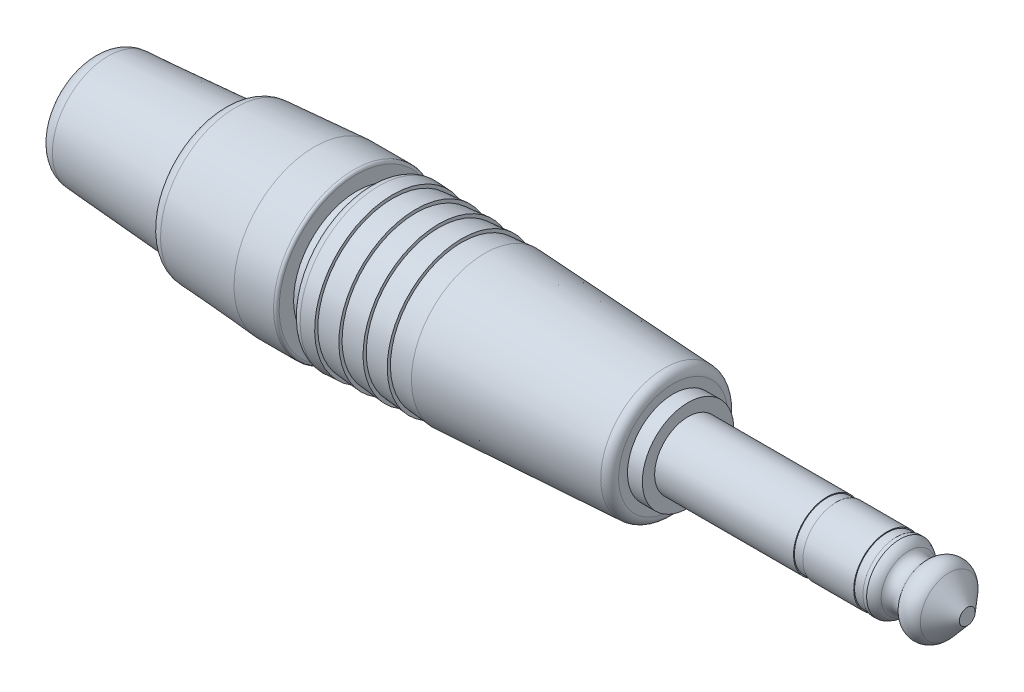
ISO-10303-21;
HEADER;
FILE_DESCRIPTION(('STEP AP214'),'2;1');
FILE_NAME('part.step','',(''),(''),'','','');
FILE_SCHEMA(('AUTOMOTIVE_DESIGN { 1 0 10303 214 1 1 1 1 }'));
ENDSEC;
DATA;
#1=APPLICATION_CONTEXT('core data for automotive mechanical design processes');
#2=APPLICATION_PROTOCOL_DEFINITION('international standard','automotive_design',2000,#1);
#3=PRODUCT_CONTEXT('',#1,'mechanical');
#4=PRODUCT('Part','Part','',(#3));
#5=PRODUCT_RELATED_PRODUCT_CATEGORY('part','',(#4));
#6=PRODUCT_DEFINITION_FORMATION('','',#4);
#7=PRODUCT_DEFINITION_CONTEXT('part definition',#1,'design');
#8=PRODUCT_DEFINITION('design','',#6,#7);
#9=PRODUCT_DEFINITION_SHAPE('','',#8);
#10=(LENGTH_UNIT() NAMED_UNIT(*) SI_UNIT(.MILLI.,.METRE.));
#11=(NAMED_UNIT(*) PLANE_ANGLE_UNIT() SI_UNIT($,.RADIAN.));
#12=(NAMED_UNIT(*) SI_UNIT($,.STERADIAN.) SOLID_ANGLE_UNIT());
#13=UNCERTAINTY_MEASURE_WITH_UNIT(LENGTH_MEASURE(1.E-05),#10,'distance_accuracy_value','');
#14=(GEOMETRIC_REPRESENTATION_CONTEXT(3) GLOBAL_UNCERTAINTY_ASSIGNED_CONTEXT((#13)) GLOBAL_UNIT_ASSIGNED_CONTEXT((#10,
#11,#12)) REPRESENTATION_CONTEXT('',''));
#15=CARTESIAN_POINT('',(0.,0.,0.));
#16=DIRECTION('',(0.,0.,1.));
#17=DIRECTION('',(1.,0.,0.));
#18=AXIS2_PLACEMENT_3D('',#15,#16,#17);
#19=CARTESIAN_POINT('',(-13.9107992685888,2.4753362952,0.));
#20=DIRECTION('',(1.,0.,0.));
#21=DIRECTION('',(0.,1.,0.));
#22=AXIS2_PLACEMENT_3D('',#19,#20,#21);
#23=PLANE('',#22);
#24=CARTESIAN_POINT('',(-13.9107992685888,0.,0.));
#25=DIRECTION('',(1.,0.,0.));
#26=DIRECTION('',(0.,1.,0.));
#27=AXIS2_PLACEMENT_3D('',#24,#25,#26);
#28=CIRCLE('',#27,2.4753362952);
#29=CARTESIAN_POINT('',(-13.9107992685888,2.4753362952,0.));
#30=VERTEX_POINT('',#29);
#31=EDGE_CURVE('E153',#30,#30,#28,.T.);
#32=ORIENTED_EDGE('',*,*,#31,.T.);
#33=EDGE_LOOP('',(#32));
#34=FACE_BOUND('',#33,.T.);
#35=CARTESIAN_POINT('',(-13.9107992685888,0.,0.));
#36=DIRECTION('',(1.,0.,0.));
#37=DIRECTION('',(0.,1.,0.));
#38=AXIS2_PLACEMENT_3D('',#35,#36,#37);
#39=CIRCLE('',#38,1.8088996248);
#40=CARTESIAN_POINT('',(-13.9107992685888,1.8088996248,0.));
#41=VERTEX_POINT('',#40);
#42=EDGE_CURVE('E10',#41,#41,#39,.T.);
#43=ORIENTED_EDGE('',*,*,#42,.F.);
#44=EDGE_LOOP('',(#43));
#45=FACE_BOUND('',#44,.T.);
#46=ADVANCED_FACE('F35',(#34,#45),#23,.T.);
#47=CARTESIAN_POINT('',(1.20197850261119,0.,0.));
#48=DIRECTION('',(1.,0.,0.));
#49=DIRECTION('',(0.,1.,0.));
#50=AXIS2_PLACEMENT_3D('',#47,#48,#49);
#51=CYLINDRICAL_SURFACE('',#50,1.8088996248);
#52=ORIENTED_EDGE('',*,*,#42,.T.);
#53=EDGE_LOOP('',(#52));
#54=FACE_BOUND('',#53,.T.);
#55=CARTESIAN_POINT('',(-6.39459604298881,0.,0.));
#56=DIRECTION('',(1.,0.,0.));
#57=DIRECTION('',(0.,1.,0.));
#58=AXIS2_PLACEMENT_3D('',#55,#56,#57);
#59=CIRCLE('',#58,1.8088996248);
#60=CARTESIAN_POINT('',(-6.39459604298881,1.8088996248,0.));
#61=VERTEX_POINT('',#60);
#62=EDGE_CURVE('E41',#61,#61,#59,.T.);
#63=ORIENTED_EDGE('',*,*,#62,.F.);
#64=EDGE_LOOP('',(#63));
#65=FACE_BOUND('',#64,.T.);
#66=ADVANCED_FACE('F171',(#54,#65),#51,.T.);
#67=CARTESIAN_POINT('',(-6.39459598904329,1.8088996248,0.));
#68=DIRECTION('',(1.,0.,0.));
#69=DIRECTION('',(0.,1.,0.));
#70=AXIS2_PLACEMENT_3D('',#67,#68,#69);
#71=PLANE('',#70);
#72=ORIENTED_EDGE('',*,*,#62,.T.);
#73=EDGE_LOOP('',(#72));
#74=FACE_BOUND('',#73,.T.);
#75=CARTESIAN_POINT('',(-6.39459593509778,0.,0.));
#76=DIRECTION('',(1.,0.,0.));
#77=DIRECTION('',(0.,1.,0.));
#78=AXIS2_PLACEMENT_3D('',#75,#76,#77);
#79=CIRCLE('',#78,1.7612968964208);
#80=CARTESIAN_POINT('',(-6.39459593509778,1.7612968964208,0.));
#81=VERTEX_POINT('',#80);
#82=EDGE_CURVE('E45',#81,#81,#79,.T.);
#83=ORIENTED_EDGE('',*,*,#82,.F.);
#84=EDGE_LOOP('',(#83));
#85=FACE_BOUND('',#84,.T.);
#86=ADVANCED_FACE('F175',(#74,#85),#71,.T.);
#87=CARTESIAN_POINT('',(1.20197850261119,0.,0.));
#88=DIRECTION('',(1.,0.,0.));
#89=DIRECTION('',(0.,1.,0.));
#90=AXIS2_PLACEMENT_3D('',#87,#88,#89);
#91=CYLINDRICAL_SURFACE('',#90,1.7612968964208);
#92=ORIENTED_EDGE('',*,*,#82,.T.);
#93=EDGE_LOOP('',(#92));
#94=FACE_BOUND('',#93,.T.);
#95=CARTESIAN_POINT('',(-5.89351570861825,0.,0.));
#96=DIRECTION('',(1.,0.,0.));
#97=DIRECTION('',(0.,1.,0.));
#98=AXIS2_PLACEMENT_3D('',#95,#96,#97);
#99=CIRCLE('',#98,1.7612968964208);
#100=CARTESIAN_POINT('',(-5.89351570861825,1.7612968964208,0.));
#101=VERTEX_POINT('',#100);
#102=EDGE_CURVE('E49',#101,#101,#99,.T.);
#103=ORIENTED_EDGE('',*,*,#102,.F.);
#104=EDGE_LOOP('',(#103));
#105=FACE_BOUND('',#104,.T.);
#106=ADVANCED_FACE('F179',(#94,#105),#91,.T.);
#107=CARTESIAN_POINT('',(-5.89351570861825,1.7612968964208,0.));
#108=DIRECTION('',(-1.,0.,0.));
#109=DIRECTION('',(0.,-1.,0.));
#110=AXIS2_PLACEMENT_3D('',#107,#108,#109);
#111=PLANE('',#110);
#112=ORIENTED_EDGE('',*,*,#102,.T.);
#113=EDGE_LOOP('',(#112));
#114=FACE_BOUND('',#113,.T.);
#115=CARTESIAN_POINT('',(-5.89351570861825,0.,0.));
#116=DIRECTION('',(1.,0.,0.));
#117=DIRECTION('',(0.,1.,0.));
#118=AXIS2_PLACEMENT_3D('',#115,#116,#117);
#119=CIRCLE('',#118,1.8088996248);
#120=CARTESIAN_POINT('',(-5.89351570861825,1.8088996248,0.));
#121=VERTEX_POINT('',#120);
#122=EDGE_CURVE('E54',#121,#121,#119,.T.);
#123=ORIENTED_EDGE('',*,*,#122,.F.);
#124=EDGE_LOOP('',(#123));
#125=FACE_BOUND('',#124,.T.);
#126=ADVANCED_FACE('F185',(#114,#125),#111,.T.);
#127=CARTESIAN_POINT('',(1.20197850261119,0.,0.));
#128=DIRECTION('',(1.,0.,0.));
#129=DIRECTION('',(0.,1.,0.));
#130=AXIS2_PLACEMENT_3D('',#127,#128,#129);
#131=CYLINDRICAL_SURFACE('',#130,1.8088996248);
#132=ORIENTED_EDGE('',*,*,#122,.T.);
#133=EDGE_LOOP('',(#132));
#134=FACE_BOUND('',#133,.T.);
#135=CARTESIAN_POINT('',(-3.13757446284096,0.,0.));
#136=DIRECTION('',(1.,0.,0.));
#137=DIRECTION('',(0.,1.,0.));
#138=AXIS2_PLACEMENT_3D('',#135,#136,#137);
#139=CIRCLE('',#138,1.8088996248);
#140=CARTESIAN_POINT('',(-3.13757446284096,1.8088996248,0.));
#141=VERTEX_POINT('',#140);
#142=EDGE_CURVE('E57',#141,#141,#139,.T.);
#143=ORIENTED_EDGE('',*,*,#142,.F.);
#144=EDGE_LOOP('',(#143));
#145=FACE_BOUND('',#144,.T.);
#146=ADVANCED_FACE('F189',(#134,#145),#131,.T.);
#147=CARTESIAN_POINT('',(-3.13757446284096,1.8088996248,0.));
#148=DIRECTION('',(1.,0.,0.));
#149=DIRECTION('',(0.,1.,0.));
#150=AXIS2_PLACEMENT_3D('',#147,#148,#149);
#151=PLANE('',#150);
#152=ORIENTED_EDGE('',*,*,#142,.T.);
#153=EDGE_LOOP('',(#152));
#154=FACE_BOUND('',#153,.T.);
#155=CARTESIAN_POINT('',(-3.13757446284096,0.,0.));
#156=DIRECTION('',(1.,0.,0.));
#157=DIRECTION('',(0.,1.,0.));
#158=AXIS2_PLACEMENT_3D('',#155,#156,#157);
#159=CIRCLE('',#158,1.7612968964208);
#160=CARTESIAN_POINT('',(-3.13757446284096,1.7612968964208,0.));
#161=VERTEX_POINT('',#160);
#162=EDGE_CURVE('E60',#161,#161,#159,.T.);
#163=ORIENTED_EDGE('',*,*,#162,.F.);
#164=EDGE_LOOP('',(#163));
#165=FACE_BOUND('',#164,.T.);
#166=ADVANCED_FACE('F193',(#154,#165),#151,.T.);
#167=CARTESIAN_POINT('',(1.20197850261119,0.,0.));
#168=DIRECTION('',(1.,0.,0.));
#169=DIRECTION('',(0.,1.,0.));
#170=AXIS2_PLACEMENT_3D('',#167,#168,#169);
#171=CYLINDRICAL_SURFACE('',#170,1.7612968964208);
#172=ORIENTED_EDGE('',*,*,#162,.T.);
#173=EDGE_LOOP('',(#172));
#174=FACE_BOUND('',#173,.T.);
#175=CARTESIAN_POINT('',(-2.63649423633602,0.,0.));
#176=DIRECTION('',(1.,0.,0.));
#177=DIRECTION('',(0.,1.,0.));
#178=AXIS2_PLACEMENT_3D('',#175,#176,#177);
#179=CIRCLE('',#178,1.7612968964208);
#180=CARTESIAN_POINT('',(-2.63649423633602,1.7612968964208,0.));
#181=VERTEX_POINT('',#180);
#182=EDGE_CURVE('E63',#181,#181,#179,.T.);
#183=ORIENTED_EDGE('',*,*,#182,.F.);
#184=EDGE_LOOP('',(#183));
#185=FACE_BOUND('',#184,.T.);
#186=ADVANCED_FACE('F197',(#174,#185),#171,.T.);
#187=CARTESIAN_POINT('',(-2.63649423633602,1.7612968964208,0.));
#188=DIRECTION('',(-1.,0.,0.));
#189=DIRECTION('',(0.,-1.,0.));
#190=AXIS2_PLACEMENT_3D('',#187,#188,#189);
#191=PLANE('',#190);
#192=ORIENTED_EDGE('',*,*,#182,.T.);
#193=EDGE_LOOP('',(#192));
#194=FACE_BOUND('',#193,.T.);
#195=CARTESIAN_POINT('',(-2.63649423633602,0.,0.));
#196=DIRECTION('',(1.,0.,0.));
#197=DIRECTION('',(0.,1.,0.));
#198=AXIS2_PLACEMENT_3D('',#195,#196,#197);
#199=CIRCLE('',#198,1.8088996248);
#200=CARTESIAN_POINT('',(-2.63649423633602,1.8088996248,0.));
#201=VERTEX_POINT('',#200);
#202=EDGE_CURVE('E66',#201,#201,#199,.T.);
#203=ORIENTED_EDGE('',*,*,#202,.F.);
#204=EDGE_LOOP('',(#203));
#205=FACE_BOUND('',#204,.T.);
#206=ADVANCED_FACE('F201',(#194,#205),#191,.T.);
#207=CARTESIAN_POINT('',(1.20197850261119,0.,0.));
#208=DIRECTION('',(1.,0.,0.));
#209=DIRECTION('',(0.,1.,0.));
#210=AXIS2_PLACEMENT_3D('',#207,#208,#209);
#211=CYLINDRICAL_SURFACE('',#210,1.8088996248);
#212=ORIENTED_EDGE('',*,*,#202,.T.);
#213=EDGE_LOOP('',(#212));
#214=FACE_BOUND('',#213,.T.);
#215=CARTESIAN_POINT('',(-2.43836338538881,0.,0.));
#216=DIRECTION('',(1.,0.,0.));
#217=DIRECTION('',(0.,1.,0.));
#218=AXIS2_PLACEMENT_3D('',#215,#216,#217);
#219=CIRCLE('',#218,1.8088996248);
#220=CARTESIAN_POINT('',(-2.43836338538881,1.8088996248,0.));
#221=VERTEX_POINT('',#220);
#222=EDGE_CURVE('E69',#221,#221,#219,.T.);
#223=ORIENTED_EDGE('',*,*,#222,.F.);
#224=EDGE_LOOP('',(#223));
#225=FACE_BOUND('',#224,.T.);
#226=ADVANCED_FACE('F205',(#214,#225),#211,.T.);
#227=CARTESIAN_POINT('',(-2.63649376194787,0.,0.));
#228=DIRECTION('',(1.,0.,0.));
#229=DIRECTION('',(0.,1.,0.));
#230=AXIS2_PLACEMENT_3D('',#227,#228,#229);
#231=TOROIDAL_SURFACE('',#230,1.03800121606845,0.795952261571177);
#232=ORIENTED_EDGE('',*,*,#222,.T.);
#233=EDGE_LOOP('',(#232));
#234=FACE_BOUND('',#233,.T.);
#235=CARTESIAN_POINT('',(-1.9770349263931,0.,0.));
#236=DIRECTION('',(1.,0.,0.));
#237=DIRECTION('',(0.,1.,0.));
#238=AXIS2_PLACEMENT_3D('',#235,#236,#237);
#239=CIRCLE('',#238,1.48370744993669);
#240=CARTESIAN_POINT('',(-1.9770349263931,1.48370744993669,0.));
#241=VERTEX_POINT('',#240);
#242=EDGE_CURVE('E72',#241,#241,#239,.T.);
#243=ORIENTED_EDGE('',*,*,#242,.F.);
#244=EDGE_LOOP('',(#243));
#245=FACE_BOUND('',#244,.T.);
#246=ADVANCED_FACE('F209',(#234,#245),#231,.T.);
#247=CARTESIAN_POINT('',(-1.50906383462453,0.,0.));
#248=DIRECTION('',(1.,0.,0.));
#249=DIRECTION('',(0.,1.,0.));
#250=AXIS2_PLACEMENT_3D('',#247,#248,#249);
#251=TOROIDAL_SURFACE('',#250,1.79999350393415,0.564830780574451);
#252=ORIENTED_EDGE('',*,*,#242,.T.);
#253=EDGE_LOOP('',(#252));
#254=FACE_BOUND('',#253,.T.);
#255=CARTESIAN_POINT('',(-1.04109280540798,0.,0.));
#256=DIRECTION('',(1.,0.,0.));
#257=DIRECTION('',(0.,1.,0.));
#258=AXIS2_PLACEMENT_3D('',#255,#256,#257);
#259=CIRCLE('',#258,1.4837073573859);
#260=CARTESIAN_POINT('',(-1.04109280540798,1.48370735738589,0.));
#261=VERTEX_POINT('',#260);
#262=EDGE_CURVE('E75',#261,#261,#259,.T.);
#263=ORIENTED_EDGE('',*,*,#262,.F.);
#264=EDGE_LOOP('',(#263));
#265=FACE_BOUND('',#264,.T.);
#266=ADVANCED_FACE('F213',(#254,#265),#251,.F.);
#267=CARTESIAN_POINT('',(-0.381633227093434,0.,0.));
#268=DIRECTION('',(1.,0.,0.));
#269=DIRECTION('',(0.,1.,0.));
#270=AXIS2_PLACEMENT_3D('',#267,#268,#269);
#271=TOROIDAL_SURFACE('',#270,1.03800043151352,0.795953264458032);
#272=ORIENTED_EDGE('',*,*,#262,.T.);
#273=EDGE_LOOP('',(#272));
#274=FACE_BOUND('',#273,.T.);
#275=CARTESIAN_POINT('',(0.219224179411191,0.,0.));
#276=DIRECTION('',(1.,0.,0.));
#277=DIRECTION('',(0.,1.,0.));
#278=AXIS2_PLACEMENT_3D('',#275,#276,#277);
#279=CIRCLE('',#278,1.560027228);
#280=CARTESIAN_POINT('',(0.219224179411191,-1.560027228,0.));
#281=VERTEX_POINT('',#280);
#282=EDGE_CURVE('E78',#281,#281,#279,.T.);
#283=ORIENTED_EDGE('',*,*,#282,.F.);
#284=EDGE_LOOP('',(#283));
#285=FACE_BOUND('',#284,.T.);
#286=ADVANCED_FACE('F217',(#274,#285),#271,.T.);
#287=CARTESIAN_POINT('',(1.20197850261119,0.,0.));
#288=DIRECTION('',(-1.,0.,0.));
#289=DIRECTION('',(0.,-1.,0.));
#290=AXIS2_PLACEMENT_3D('',#287,#288,#289);
#291=CONICAL_SURFACE('',#290,0.428868410400003,0.855486854973769);
#292=CARTESIAN_POINT('',(1.20197850261119,0.,0.));
#293=DIRECTION('',(1.,0.,0.));
#294=DIRECTION('',(0.,1.,0.));
#295=AXIS2_PLACEMENT_3D('',#292,#293,#294);
#296=CIRCLE('',#295,0.428868410400003);
#297=CARTESIAN_POINT('',(1.20197850261119,-0.428868410400006,0.));
#298=VERTEX_POINT('',#297);
#299=EDGE_CURVE('E81',#298,#298,#296,.T.);
#300=CARTESIAN_POINT('',(0.219224179411191,-1.560027228,0.));
#301=CARTESIAN_POINT('',(0.229461203611191,-1.54824432365,0.));
#302=CARTESIAN_POINT('',(0.239698227811191,-1.5364614193,0.));
#303=CARTESIAN_POINT('',(0.260172276211191,-1.5128956106,0.));
#304=CARTESIAN_POINT('',(0.270409300411191,-1.50111270625,0.));
#305=CARTESIAN_POINT('',(0.290883348811191,-1.47754689755,0.));
#306=CARTESIAN_POINT('',(0.301120373011191,-1.4657639932,0.));
#307=CARTESIAN_POINT('',(0.321594421411191,-1.4421981845,0.));
#308=CARTESIAN_POINT('',(0.331831445611191,-1.43041528015,0.));
#309=CARTESIAN_POINT('',(0.352305494011191,-1.40684947145,0.));
#310=CARTESIAN_POINT('',(0.362542518211191,-1.3950665671,0.));
#311=CARTESIAN_POINT('',(0.383016566611191,-1.3715007584,0.));
#312=CARTESIAN_POINT('',(0.393253590811191,-1.35971785405,0.));
#313=CARTESIAN_POINT('',(0.413727639211191,-1.33615204535,0.));
#314=CARTESIAN_POINT('',(0.423964663411191,-1.324369141,0.));
#315=CARTESIAN_POINT('',(0.444438711811191,-1.3008033323,0.));
#316=CARTESIAN_POINT('',(0.454675736011191,-1.28902042795,0.));
#317=CARTESIAN_POINT('',(0.475149784411191,-1.26545461925,0.));
#318=CARTESIAN_POINT('',(0.485386808611191,-1.2536717149,0.));
#319=CARTESIAN_POINT('',(0.505860857011191,-1.2301059062,0.));
#320=CARTESIAN_POINT('',(0.516097881211191,-1.21832300185,0.));
#321=CARTESIAN_POINT('',(0.53657192961119,-1.19475719315,0.));
#322=CARTESIAN_POINT('',(0.54680895381119,-1.1829742888,0.));
#323=CARTESIAN_POINT('',(0.56728300221119,-1.1594084801,0.));
#324=CARTESIAN_POINT('',(0.57752002641119,-1.14762557575,0.));
#325=CARTESIAN_POINT('',(0.59799407481119,-1.12405976705,0.));
#326=CARTESIAN_POINT('',(0.60823109901119,-1.1122768627,0.));
#327=CARTESIAN_POINT('',(0.62870514741119,-1.088711054,0.));
#328=CARTESIAN_POINT('',(0.63894217161119,-1.07692814965,0.));
#329=CARTESIAN_POINT('',(0.65941622001119,-1.05336234095,0.));
#330=CARTESIAN_POINT('',(0.66965324421119,-1.0415794366,0.));
#331=CARTESIAN_POINT('',(0.69012729261119,-1.0180136279,0.));
#332=CARTESIAN_POINT('',(0.70036431681119,-1.00623072355,0.));
#333=CARTESIAN_POINT('',(0.72083836521119,-0.982664914850004,0.));
#334=CARTESIAN_POINT('',(0.73107538941119,-0.970882010500004,0.));
#335=CARTESIAN_POINT('',(0.75154943781119,-0.947316201800004,0.));
#336=CARTESIAN_POINT('',(0.76178646201119,-0.935533297450004,0.));
#337=CARTESIAN_POINT('',(0.78226051041119,-0.911967488750005,0.));
#338=CARTESIAN_POINT('',(0.79249753461119,-0.900184584400005,0.));
#339=CARTESIAN_POINT('',(0.81297158301119,-0.876618775700005,0.));
#340=CARTESIAN_POINT('',(0.823208607211189,-0.864835871350005,0.));
#341=CARTESIAN_POINT('',(0.843682655611189,-0.841270062650005,0.));
#342=CARTESIAN_POINT('',(0.853919679811189,-0.829487158300005,0.));
#343=CARTESIAN_POINT('',(0.874393728211189,-0.805921349600005,0.));
#344=CARTESIAN_POINT('',(0.884630752411189,-0.794138445250005,0.));
#345=CARTESIAN_POINT('',(0.905104800811189,-0.770572636550005,0.));
#346=CARTESIAN_POINT('',(0.915341825011189,-0.758789732200005,0.));
#347=CARTESIAN_POINT('',(0.935815873411189,-0.735223923500005,0.));
#348=CARTESIAN_POINT('',(0.946052897611189,-0.723441019150005,0.));
#349=CARTESIAN_POINT('',(0.966526946011189,-0.699875210450005,0.));
#350=CARTESIAN_POINT('',(0.976763970211189,-0.688092306100005,0.));
#351=CARTESIAN_POINT('',(0.997238018611189,-0.664526497400005,0.));
#352=CARTESIAN_POINT('',(1.00747504281119,-0.652743593050006,0.));
#353=CARTESIAN_POINT('',(1.02794909121119,-0.629177784350006,0.));
#354=CARTESIAN_POINT('',(1.03818611541119,-0.617394880000006,0.));
#355=CARTESIAN_POINT('',(1.05866016381119,-0.593829071300006,0.));
#356=CARTESIAN_POINT('',(1.06889718801119,-0.582046166950006,0.));
#357=CARTESIAN_POINT('',(1.08937123641119,-0.558480358250006,0.));
#358=CARTESIAN_POINT('',(1.09960826061119,-0.546697453900006,0.));
#359=CARTESIAN_POINT('',(1.12008230901119,-0.523131645200006,0.));
#360=CARTESIAN_POINT('',(1.13031933321119,-0.511348740850006,0.));
#361=CARTESIAN_POINT('',(1.15079338161119,-0.487782932150006,0.));
#362=CARTESIAN_POINT('',(1.16103040581119,-0.476000027800006,0.));
#363=CARTESIAN_POINT('',(1.18150445421119,-0.452434219100006,0.));
#364=CARTESIAN_POINT('',(1.19174147841119,-0.440651314750006,0.));
#365=CARTESIAN_POINT('',(1.20197850261119,-0.428868410400006,0.));
#366=B_SPLINE_CURVE_WITH_KNOTS('',3,(#300,#301,#302,#303,#304,#305,#306,#307,#308,#309,#310,
#311,#312,#313,#314,#315,#316,#317,#318,#319,#320,#321,#322,#323,#324,#325,#326,#327,#328,#329,
#330,#331,#332,#333,#334,#335,#336,#337,#338,#339,#340,#341,#342,#343,#344,#345,#346,#347,#348,
#349,#350,#351,#352,#353,#354,#355,#356,#357,#358,#359,#360,#361,#362,#363,#364,#365),
.UNSPECIFIED.,.F.,.F.,(4,2,2,2,2,2,2,2,2,2,2,2,2,2,2,2,2,2,2,2,2,2,2,2,2,2,2,2,2,2,2,2,4),(0.,
0.0468262906339344,0.0936525812678688,0.140478871901803,0.187305162535738,0.234131453169672,
0.280957743803607,0.327784034437541,0.374610325071475,0.42143661570541,0.468262906339344,
0.515089196973279,0.561915487607213,0.608741778241148,0.655568068875082,0.702394359509017,
0.749220650142951,0.796046940776885,0.84287323141082,0.889699522044754,0.936525812678689,
0.983352103312623,1.03017839394656,1.07700468458049,1.12383097521443,1.17065726584836,
1.2174835564823,1.26430984711623,1.31113613775016,1.3579624283841,1.40478871901803,
1.45161500965197,1.4984413002859),.UNSPECIFIED.);
#367=EDGE_CURVE('BSEAM221',#281,#298,#366,.T.);
#368=ORIENTED_EDGE('',*,*,#282,.T.);
#369=ORIENTED_EDGE('',*,*,#299,.F.);
#370=ORIENTED_EDGE('',*,*,#367,.T.);
#371=ORIENTED_EDGE('',*,*,#367,.F.);
#372=EDGE_LOOP('',(#368,#370,#369,#371));
#373=FACE_BOUND('',#372,.T.);
#374=ADVANCED_FACE('F221',(#373),#291,.T.);
#375=CARTESIAN_POINT('',(1.20197850261119,0.428868410399999,0.));
#376=DIRECTION('',(1.,0.,0.));
#377=DIRECTION('',(0.,1.,0.));
#378=AXIS2_PLACEMENT_3D('',#375,#376,#377);
#379=PLANE('',#378);
#380=ORIENTED_EDGE('',*,*,#299,.T.);
#381=EDGE_LOOP('',(#380));
#382=FACE_BOUND('',#381,.T.);
#383=ADVANCED_FACE('F225',(#382),#379,.T.);
#384=CARTESIAN_POINT('',(-46.2155769501888,2.0325424104,0.));
#385=DIRECTION('',(-1.,0.,0.));
#386=DIRECTION('',(0.,-1.,0.));
#387=AXIS2_PLACEMENT_3D('',#384,#385,#386);
#388=PLANE('',#387);
#389=CARTESIAN_POINT('',(-46.2155769501888,0.,0.));
#390=DIRECTION('',(1.,0.,0.));
#391=DIRECTION('',(0.,1.,0.));
#392=AXIS2_PLACEMENT_3D('',#389,#390,#391);
#393=CIRCLE('',#392,2.03254241040001);
#394=CARTESIAN_POINT('',(-46.2155769501888,2.0325424104,0.));
#395=VERTEX_POINT('',#394);
#396=EDGE_CURVE('E84',#395,#395,#393,.T.);
#397=ORIENTED_EDGE('',*,*,#396,.F.);
#398=EDGE_LOOP('',(#397));
#399=FACE_BOUND('',#398,.T.);
#400=ADVANCED_FACE('F229',(#399),#388,.T.);
#401=CARTESIAN_POINT('',(-45.2200952795863,0.,0.));
#402=DIRECTION('',(1.,0.,0.));
#403=DIRECTION('',(0.,1.,0.));
#404=AXIS2_PLACEMENT_3D('',#401,#402,#403);
#405=TOROIDAL_SURFACE('',#404,2.03254174807819,0.995481670602716);
#406=ORIENTED_EDGE('',*,*,#396,.T.);
#407=EDGE_LOOP('',(#406));
#408=FACE_BOUND('',#407,.T.);
#409=CARTESIAN_POINT('',(-45.2895375453888,0.,0.));
#410=DIRECTION('',(1.,0.,0.));
#411=DIRECTION('',(0.,1.,0.));
#412=AXIS2_PLACEMENT_3D('',#409,#410,#411);
#413=CIRCLE('',#412,3.02559840720001);
#414=CARTESIAN_POINT('',(-45.2895375453888,3.0255984072,0.));
#415=VERTEX_POINT('',#414);
#416=EDGE_CURVE('E87',#415,#415,#413,.T.);
#417=ORIENTED_EDGE('',*,*,#416,.F.);
#418=EDGE_LOOP('',(#417));
#419=FACE_BOUND('',#418,.T.);
#420=ADVANCED_FACE('F233',(#408,#419),#405,.T.);
#421=CARTESIAN_POINT('',(-39.0974998029888,0.,0.));
#422=DIRECTION('',(1.,0.,0.));
#423=DIRECTION('',(0.,1.,0.));
#424=AXIS2_PLACEMENT_3D('',#421,#422,#423);
#425=CONICAL_SURFACE('',#424,3.45858771600001,0.069813145979432);
#426=ORIENTED_EDGE('',*,*,#416,.T.);
#427=EDGE_LOOP('',(#426));
#428=FACE_BOUND('',#427,.T.);
#429=CARTESIAN_POINT('',(-39.0974998029888,0.,0.));
#430=DIRECTION('',(1.,0.,0.));
#431=DIRECTION('',(0.,1.,0.));
#432=AXIS2_PLACEMENT_3D('',#429,#430,#431);
#433=CIRCLE('',#432,3.45858771600001);
#434=CARTESIAN_POINT('',(-39.0974998029888,3.458587716,0.));
#435=VERTEX_POINT('',#434);
#436=EDGE_CURVE('E90',#435,#435,#433,.T.);
#437=ORIENTED_EDGE('',*,*,#436,.F.);
#438=EDGE_LOOP('',(#437));
#439=FACE_BOUND('',#438,.T.);
#440=ADVANCED_FACE('F237',(#428,#439),#425,.T.);
#441=CARTESIAN_POINT('',(-38.3524726898504,0.,0.));
#442=DIRECTION('',(1.,0.,0.));
#443=DIRECTION('',(0.,1.,0.));
#444=AXIS2_PLACEMENT_3D('',#441,#442,#443);
#445=TOROIDAL_SURFACE('',#444,3.29350204417,0.763097993728807);
#446=ORIENTED_EDGE('',*,*,#436,.T.);
#447=EDGE_LOOP('',(#446));
#448=FACE_BOUND('',#447,.T.);
#449=CARTESIAN_POINT('',(-38.4057042921454,0.,0.));
#450=DIRECTION('',(1.,0.,0.));
#451=DIRECTION('',(0.,1.,0.));
#452=AXIS2_PLACEMENT_3D('',#449,#450,#451);
#453=CIRCLE('',#452,4.05474112918208);
#454=CARTESIAN_POINT('',(-38.4057042921454,4.05474112918208,0.));
#455=VERTEX_POINT('',#454);
#456=EDGE_CURVE('E93',#455,#455,#453,.T.);
#457=ORIENTED_EDGE('',*,*,#456,.F.);
#458=EDGE_LOOP('',(#457));
#459=FACE_BOUND('',#458,.T.);
#460=ADVANCED_FACE('F241',(#448,#459),#445,.T.);
#461=CARTESIAN_POINT('',(-34.1300019597888,0.,0.));
#462=DIRECTION('',(1.,0.,0.));
#463=DIRECTION('',(0.,1.,0.));
#464=AXIS2_PLACEMENT_3D('',#461,#462,#463);
#465=CONICAL_SURFACE('',#464,4.35372744240001,0.0698131887681831);
#466=ORIENTED_EDGE('',*,*,#456,.T.);
#467=EDGE_LOOP('',(#466));
#468=FACE_BOUND('',#467,.T.);
#469=CARTESIAN_POINT('',(-34.1300019597888,0.,0.));
#470=DIRECTION('',(1.,0.,0.));
#471=DIRECTION('',(0.,1.,0.));
#472=AXIS2_PLACEMENT_3D('',#469,#470,#471);
#473=CIRCLE('',#472,4.35372744240001);
#474=CARTESIAN_POINT('',(-34.1300019597888,4.3537274424,0.));
#475=VERTEX_POINT('',#474);
#476=EDGE_CURVE('E96',#475,#475,#473,.T.);
#477=ORIENTED_EDGE('',*,*,#476,.F.);
#478=EDGE_LOOP('',(#477));
#479=FACE_BOUND('',#478,.T.);
#480=ADVANCED_FACE('F245',(#468,#479),#465,.T.);
#481=CARTESIAN_POINT('',(1.20197850261119,0.,0.));
#482=DIRECTION('',(1.,0.,0.));
#483=DIRECTION('',(0.,1.,0.));
#484=AXIS2_PLACEMENT_3D('',#481,#482,#483);
#485=CYLINDRICAL_SURFACE('',#484,4.35372744240001);
#486=ORIENTED_EDGE('',*,*,#476,.T.);
#487=EDGE_LOOP('',(#486));
#488=FACE_BOUND('',#487,.T.);
#489=CARTESIAN_POINT('',(-31.9933296861888,0.,0.));
#490=DIRECTION('',(1.,0.,0.));
#491=DIRECTION('',(0.,1.,0.));
#492=AXIS2_PLACEMENT_3D('',#489,#490,#491);
#493=CIRCLE('',#492,4.35372744240001);
#494=CARTESIAN_POINT('',(-31.9933296861888,4.3537274424,0.));
#495=VERTEX_POINT('',#494);
#496=EDGE_CURVE('E99',#495,#495,#493,.T.);
#497=ORIENTED_EDGE('',*,*,#496,.F.);
#498=EDGE_LOOP('',(#497));
#499=FACE_BOUND('',#498,.T.);
#500=ADVANCED_FACE('F249',(#488,#499),#485,.T.);
#501=CARTESIAN_POINT('',(-31.9933296993665,0.,0.));
#502=DIRECTION('',(1.,0.,0.));
#503=DIRECTION('',(0.,1.,0.));
#504=AXIS2_PLACEMENT_3D('',#501,#502,#503);
#505=TOROIDAL_SURFACE('',#504,4.20110803562209,0.152619406777919);
#506=ORIENTED_EDGE('',*,*,#496,.T.);
#507=EDGE_LOOP('',(#506));
#508=FACE_BOUND('',#507,.T.);
#509=CARTESIAN_POINT('',(-31.8407102925888,0.,0.));
#510=DIRECTION('',(1.,0.,0.));
#511=DIRECTION('',(0.,1.,0.));
#512=AXIS2_PLACEMENT_3D('',#509,#510,#511);
#513=CIRCLE('',#512,4.20110779440001);
#514=CARTESIAN_POINT('',(-31.8407102925888,4.2011077944,0.));
#515=VERTEX_POINT('',#514);
#516=EDGE_CURVE('E102',#515,#515,#513,.T.);
#517=ORIENTED_EDGE('',*,*,#516,.F.);
#518=EDGE_LOOP('',(#517));
#519=FACE_BOUND('',#518,.T.);
#520=ADVANCED_FACE('F253',(#508,#519),#505,.T.);
#521=CARTESIAN_POINT('',(-31.8407102925888,4.2011077944,0.));
#522=DIRECTION('',(1.,0.,0.));
#523=DIRECTION('',(0.,1.,0.));
#524=AXIS2_PLACEMENT_3D('',#521,#522,#523);
#525=PLANE('',#524);
#526=ORIENTED_EDGE('',*,*,#516,.T.);
#527=EDGE_LOOP('',(#526));
#528=FACE_BOUND('',#527,.T.);
#529=CARTESIAN_POINT('',(-31.8407102925888,0.,0.));
#530=DIRECTION('',(1.,0.,0.));
#531=DIRECTION('',(0.,1.,0.));
#532=AXIS2_PLACEMENT_3D('',#529,#530,#531);
#533=CIRCLE('',#532,3.41854057680001);
#534=CARTESIAN_POINT('',(-31.8407102925888,3.4185405768,0.));
#535=VERTEX_POINT('',#534);
#536=EDGE_CURVE('E105',#535,#535,#533,.T.);
#537=ORIENTED_EDGE('',*,*,#536,.F.);
#538=EDGE_LOOP('',(#537));
#539=FACE_BOUND('',#538,.T.);
#540=ADVANCED_FACE('F257',(#528,#539),#525,.T.);
#541=CARTESIAN_POINT('',(1.20197850261119,0.,0.));
#542=DIRECTION('',(1.,0.,0.));
#543=DIRECTION('',(0.,1.,0.));
#544=AXIS2_PLACEMENT_3D('',#541,#542,#543);
#545=CYLINDRICAL_SURFACE('',#544,3.41854057680001);
#546=ORIENTED_EDGE('',*,*,#536,.T.);
#547=EDGE_LOOP('',(#546));
#548=FACE_BOUND('',#547,.T.);
#549=CARTESIAN_POINT('',(-31.1393651085888,0.,0.));
#550=DIRECTION('',(1.,0.,0.));
#551=DIRECTION('',(0.,1.,0.));
#552=AXIS2_PLACEMENT_3D('',#549,#550,#551);
#553=CIRCLE('',#552,3.41854057680001);
#554=CARTESIAN_POINT('',(-31.1393651085888,3.4185405768,0.));
#555=VERTEX_POINT('',#554);
#556=EDGE_CURVE('E108',#555,#555,#553,.T.);
#557=ORIENTED_EDGE('',*,*,#556,.F.);
#558=EDGE_LOOP('',(#557));
#559=FACE_BOUND('',#558,.T.);
#560=ADVANCED_FACE('F261',(#548,#559),#545,.T.);
#561=CARTESIAN_POINT('',(-31.1393651085888,3.4185405768,0.));
#562=DIRECTION('',(-1.,0.,0.));
#563=DIRECTION('',(0.,-1.,0.));
#564=AXIS2_PLACEMENT_3D('',#561,#562,#563);
#565=PLANE('',#564);
#566=ORIENTED_EDGE('',*,*,#556,.T.);
#567=EDGE_LOOP('',(#566));
#568=FACE_BOUND('',#567,.T.);
#569=CARTESIAN_POINT('',(-31.1393651085888,0.,0.));
#570=DIRECTION('',(1.,0.,0.));
#571=DIRECTION('',(0.,1.,0.));
#572=AXIS2_PLACEMENT_3D('',#569,#570,#571);
#573=CIRCLE('',#572,3.7669589304);
#574=CARTESIAN_POINT('',(-31.1393651085888,3.7669589304,0.));
#575=VERTEX_POINT('',#574);
#576=EDGE_CURVE('E111',#575,#575,#573,.T.);
#577=ORIENTED_EDGE('',*,*,#576,.F.);
#578=EDGE_LOOP('',(#577));
#579=FACE_BOUND('',#578,.T.);
#580=ADVANCED_FACE('F265',(#568,#579),#565,.T.);
#581=CARTESIAN_POINT('',(-30.6416246397888,0.,0.));
#582=DIRECTION('',(1.,0.,0.));
#583=DIRECTION('',(0.,1.,0.));
#584=AXIS2_PLACEMENT_3D('',#581,#582,#583);
#585=TOROIDAL_SURFACE('',#584,3.76695893040001,0.497740468799999);
#586=ORIENTED_EDGE('',*,*,#576,.T.);
#587=EDGE_LOOP('',(#586));
#588=FACE_BOUND('',#587,.T.);
#589=CARTESIAN_POINT('',(-30.6416246397888,0.,0.));
#590=DIRECTION('',(1.,0.,0.));
#591=DIRECTION('',(0.,1.,0.));
#592=AXIS2_PLACEMENT_3D('',#589,#590,#591);
#593=CIRCLE('',#592,4.26469939920001);
#594=CARTESIAN_POINT('',(-30.6416246397888,4.2646993992,0.));
#595=VERTEX_POINT('',#594);
#596=EDGE_CURVE('E114',#595,#595,#593,.T.);
#597=ORIENTED_EDGE('',*,*,#596,.F.);
#598=EDGE_LOOP('',(#597));
#599=FACE_BOUND('',#598,.T.);
#600=ADVANCED_FACE('F269',(#588,#599),#585,.T.);
#601=CARTESIAN_POINT('',(-29.8950140637888,0.,0.));
#602=DIRECTION('',(-1.,0.,0.));
#603=DIRECTION('',(0.,-1.,0.));
#604=AXIS2_PLACEMENT_3D('',#601,#602,#603);
#605=CONICAL_SURFACE('',#604,4.22553294589684,0.0524109699944436);
#606=ORIENTED_EDGE('',*,*,#596,.T.);
#607=EDGE_LOOP('',(#606));
#608=FACE_BOUND('',#607,.T.);
#609=CARTESIAN_POINT('',(-29.8950140637888,0.,0.));
#610=DIRECTION('',(1.,0.,0.));
#611=DIRECTION('',(0.,1.,0.));
#612=AXIS2_PLACEMENT_3D('',#609,#610,#611);
#613=CIRCLE('',#612,4.22553294589684);
#614=CARTESIAN_POINT('',(-29.8950140637888,4.22553294589683,0.));
#615=VERTEX_POINT('',#614);
#616=EDGE_CURVE('E117',#615,#615,#613,.T.);
#617=ORIENTED_EDGE('',*,*,#616,.F.);
#618=EDGE_LOOP('',(#617));
#619=FACE_BOUND('',#618,.T.);
#620=ADVANCED_FACE('F273',(#608,#619),#605,.T.);
#621=CARTESIAN_POINT('',(-29.8950140637888,4.0513888152,0.));
#622=DIRECTION('',(1.,0.,0.));
#623=DIRECTION('',(0.,1.,0.));
#624=AXIS2_PLACEMENT_3D('',#621,#622,#623);
#625=PLANE('',#624);
#626=ORIENTED_EDGE('',*,*,#616,.T.);
#627=EDGE_LOOP('',(#626));
#628=FACE_BOUND('',#627,.T.);
#629=CARTESIAN_POINT('',(-29.8950140637888,0.,0.));
#630=DIRECTION('',(1.,0.,0.));
#631=DIRECTION('',(0.,1.,0.));
#632=AXIS2_PLACEMENT_3D('',#629,#630,#631);
#633=CIRCLE('',#632,4.05138881520001);
#634=CARTESIAN_POINT('',(-29.8950140637888,4.0513888152,0.));
#635=VERTEX_POINT('',#634);
#636=EDGE_CURVE('E120',#635,#635,#633,.T.);
#637=ORIENTED_EDGE('',*,*,#636,.F.);
#638=EDGE_LOOP('',(#637));
#639=FACE_BOUND('',#638,.T.);
#640=ADVANCED_FACE('F277',(#628,#639),#625,.T.);
#641=CARTESIAN_POINT('',(-28.6506632733888,0.,0.));
#642=DIRECTION('',(1.,0.,0.));
#643=DIRECTION('',(0.,1.,0.));
#644=AXIS2_PLACEMENT_3D('',#641,#642,#643);
#645=CONICAL_SURFACE('',#644,4.16025547920001,0.0872665235232193);
#646=ORIENTED_EDGE('',*,*,#636,.T.);
#647=EDGE_LOOP('',(#646));
#648=FACE_BOUND('',#647,.T.);
#649=CARTESIAN_POINT('',(-28.6506632733888,0.,0.));
#650=DIRECTION('',(1.,0.,0.));
#651=DIRECTION('',(0.,1.,0.));
#652=AXIS2_PLACEMENT_3D('',#649,#650,#651);
#653=CIRCLE('',#652,4.16025547920001);
#654=CARTESIAN_POINT('',(-28.6506632733888,4.1602554792,0.));
#655=VERTEX_POINT('',#654);
#656=EDGE_CURVE('E123',#655,#655,#653,.T.);
#657=ORIENTED_EDGE('',*,*,#656,.F.);
#658=EDGE_LOOP('',(#657));
#659=FACE_BOUND('',#658,.T.);
#660=ADVANCED_FACE('F281',(#648,#659),#645,.T.);
#661=CARTESIAN_POINT('',(-28.6506632733888,3.986111556,0.));
#662=DIRECTION('',(1.,0.,0.));
#663=DIRECTION('',(0.,1.,0.));
#664=AXIS2_PLACEMENT_3D('',#661,#662,#663);
#665=PLANE('',#664);
#666=ORIENTED_EDGE('',*,*,#656,.T.);
#667=EDGE_LOOP('',(#666));
#668=FACE_BOUND('',#667,.T.);
#669=CARTESIAN_POINT('',(-28.6506632733888,0.,0.));
#670=DIRECTION('',(1.,0.,0.));
#671=DIRECTION('',(0.,1.,0.));
#672=AXIS2_PLACEMENT_3D('',#669,#670,#671);
#673=CIRCLE('',#672,3.98611155600001);
#674=CARTESIAN_POINT('',(-28.6506632733888,3.986111556,0.));
#675=VERTEX_POINT('',#674);
#676=EDGE_CURVE('E126',#675,#675,#673,.T.);
#677=ORIENTED_EDGE('',*,*,#676,.F.);
#678=EDGE_LOOP('',(#677));
#679=FACE_BOUND('',#678,.T.);
#680=ADVANCED_FACE('F285',(#668,#679),#665,.T.);
#681=CARTESIAN_POINT('',(-27.4063122285888,0.,0.));
#682=DIRECTION('',(1.,0.,0.));
#683=DIRECTION('',(0.,1.,0.));
#684=AXIS2_PLACEMENT_3D('',#681,#682,#683);
#685=CONICAL_SURFACE('',#684,4.09497796560001,0.0872663028816064);
#686=ORIENTED_EDGE('',*,*,#676,.T.);
#687=EDGE_LOOP('',(#686));
#688=FACE_BOUND('',#687,.T.);
#689=CARTESIAN_POINT('',(-27.4063122285888,0.,0.));
#690=DIRECTION('',(1.,0.,0.));
#691=DIRECTION('',(0.,1.,0.));
#692=AXIS2_PLACEMENT_3D('',#689,#690,#691);
#693=CIRCLE('',#692,4.09497796560001);
#694=CARTESIAN_POINT('',(-27.4063122285888,4.0949779656,0.));
#695=VERTEX_POINT('',#694);
#696=EDGE_CURVE('E129',#695,#695,#693,.T.);
#697=ORIENTED_EDGE('',*,*,#696,.F.);
#698=EDGE_LOOP('',(#697));
#699=FACE_BOUND('',#698,.T.);
#700=ADVANCED_FACE('F289',(#688,#699),#685,.T.);
#701=CARTESIAN_POINT('',(-27.4063122285888,3.9208340424,0.));
#702=DIRECTION('',(1.,0.,0.));
#703=DIRECTION('',(0.,1.,0.));
#704=AXIS2_PLACEMENT_3D('',#701,#702,#703);
#705=PLANE('',#704);
#706=ORIENTED_EDGE('',*,*,#696,.T.);
#707=EDGE_LOOP('',(#706));
#708=FACE_BOUND('',#707,.T.);
#709=CARTESIAN_POINT('',(-27.4063122285888,0.,0.));
#710=DIRECTION('',(1.,0.,0.));
#711=DIRECTION('',(0.,1.,0.));
#712=AXIS2_PLACEMENT_3D('',#709,#710,#711);
#713=CIRCLE('',#712,3.9208340424);
#714=CARTESIAN_POINT('',(-27.4063122285888,3.9208340424,0.));
#715=VERTEX_POINT('',#714);
#716=EDGE_CURVE('E132',#715,#715,#713,.T.);
#717=ORIENTED_EDGE('',*,*,#716,.F.);
#718=EDGE_LOOP('',(#717));
#719=FACE_BOUND('',#718,.T.);
#720=ADVANCED_FACE('F293',(#708,#719),#705,.T.);
#721=CARTESIAN_POINT('',(-26.1619611837888,0.,0.));
#722=DIRECTION('',(1.,0.,0.));
#723=DIRECTION('',(0.,1.,0.));
#724=AXIS2_PLACEMENT_3D('',#721,#722,#723);
#725=CONICAL_SURFACE('',#724,4.02970070640001,0.0872665057725502);
#726=ORIENTED_EDGE('',*,*,#716,.T.);
#727=EDGE_LOOP('',(#726));
#728=FACE_BOUND('',#727,.T.);
#729=CARTESIAN_POINT('',(-26.1619611837888,0.,0.));
#730=DIRECTION('',(1.,0.,0.));
#731=DIRECTION('',(0.,1.,0.));
#732=AXIS2_PLACEMENT_3D('',#729,#730,#731);
#733=CIRCLE('',#732,4.02970070640001);
#734=CARTESIAN_POINT('',(-26.1619611837888,4.0297007064,0.));
#735=VERTEX_POINT('',#734);
#736=EDGE_CURVE('E135',#735,#735,#733,.T.);
#737=ORIENTED_EDGE('',*,*,#736,.F.);
#738=EDGE_LOOP('',(#737));
#739=FACE_BOUND('',#738,.T.);
#740=ADVANCED_FACE('F297',(#728,#739),#725,.T.);
#741=CARTESIAN_POINT('',(-26.1619611837888,3.8555565288,0.));
#742=DIRECTION('',(1.,0.,0.));
#743=DIRECTION('',(0.,1.,0.));
#744=AXIS2_PLACEMENT_3D('',#741,#742,#743);
#745=PLANE('',#744);
#746=ORIENTED_EDGE('',*,*,#736,.T.);
#747=EDGE_LOOP('',(#746));
#748=FACE_BOUND('',#747,.T.);
#749=CARTESIAN_POINT('',(-26.1619611837888,0.,0.));
#750=DIRECTION('',(1.,0.,0.));
#751=DIRECTION('',(0.,1.,0.));
#752=AXIS2_PLACEMENT_3D('',#749,#750,#751);
#753=CIRCLE('',#752,3.85555652880001);
#754=CARTESIAN_POINT('',(-26.1619611837888,3.8555565288,0.));
#755=VERTEX_POINT('',#754);
#756=EDGE_CURVE('E138',#755,#755,#753,.T.);
#757=ORIENTED_EDGE('',*,*,#756,.F.);
#758=EDGE_LOOP('',(#757));
#759=FACE_BOUND('',#758,.T.);
#760=ADVANCED_FACE('F301',(#748,#759),#745,.T.);
#761=CARTESIAN_POINT('',(-24.9176103933888,0.,0.));
#762=DIRECTION('',(1.,0.,0.));
#763=DIRECTION('',(0.,1.,0.));
#764=AXIS2_PLACEMENT_3D('',#761,#762,#763);
#765=CONICAL_SURFACE('',#764,3.96442319280001,0.0872665235232164);
#766=ORIENTED_EDGE('',*,*,#756,.T.);
#767=EDGE_LOOP('',(#766));
#768=FACE_BOUND('',#767,.T.);
#769=CARTESIAN_POINT('',(-24.9176103933888,0.,0.));
#770=DIRECTION('',(1.,0.,0.));
#771=DIRECTION('',(0.,1.,0.));
#772=AXIS2_PLACEMENT_3D('',#769,#770,#771);
#773=CIRCLE('',#772,3.96442319280001);
#774=CARTESIAN_POINT('',(-24.9176103933888,3.9644231928,0.));
#775=VERTEX_POINT('',#774);
#776=EDGE_CURVE('E141',#775,#775,#773,.T.);
#777=ORIENTED_EDGE('',*,*,#776,.F.);
#778=EDGE_LOOP('',(#777));
#779=FACE_BOUND('',#778,.T.);
#780=ADVANCED_FACE('F305',(#768,#779),#765,.T.);
#781=CARTESIAN_POINT('',(-15.1855976685888,0.,0.));
#782=DIRECTION('',(-1.,0.,0.));
#783=DIRECTION('',(0.,-1.,0.));
#784=AXIS2_PLACEMENT_3D('',#781,#782,#783);
#785=CONICAL_SURFACE('',#784,3.453891492,0.0524109624826425);
#786=ORIENTED_EDGE('',*,*,#776,.T.);
#787=EDGE_LOOP('',(#786));
#788=FACE_BOUND('',#787,.T.);
#789=CARTESIAN_POINT('',(-15.1855976685888,0.,0.));
#790=DIRECTION('',(1.,0.,0.));
#791=DIRECTION('',(0.,1.,0.));
#792=AXIS2_PLACEMENT_3D('',#789,#790,#791);
#793=CIRCLE('',#792,3.453891492);
#794=CARTESIAN_POINT('',(-15.1855976685888,3.453891492,0.));
#795=VERTEX_POINT('',#794);
#796=EDGE_CURVE('E144',#795,#795,#793,.T.);
#797=ORIENTED_EDGE('',*,*,#796,.F.);
#798=EDGE_LOOP('',(#797));
#799=FACE_BOUND('',#798,.T.);
#800=ADVANCED_FACE('F309',(#788,#799),#785,.T.);
#801=CARTESIAN_POINT('',(-15.2116725329335,0.,0.));
#802=DIRECTION('',(1.,0.,0.));
#803=DIRECTION('',(0.,1.,0.));
#804=AXIS2_PLACEMENT_3D('',#801,#802,#803);
#805=TOROIDAL_SURFACE('',#804,2.95683485040001,0.497740096344734);
#806=ORIENTED_EDGE('',*,*,#796,.T.);
#807=EDGE_LOOP('',(#806));
#808=FACE_BOUND('',#807,.T.);
#809=CARTESIAN_POINT('',(-14.7139324365888,0.,0.));
#810=DIRECTION('',(1.,0.,0.));
#811=DIRECTION('',(0.,1.,0.));
#812=AXIS2_PLACEMENT_3D('',#809,#810,#811);
#813=CIRCLE('',#812,2.9568348504);
#814=CARTESIAN_POINT('',(-14.7139324365888,2.9568348504,0.));
#815=VERTEX_POINT('',#814);
#816=EDGE_CURVE('E147',#815,#815,#813,.T.);
#817=ORIENTED_EDGE('',*,*,#816,.F.);
#818=EDGE_LOOP('',(#817));
#819=FACE_BOUND('',#818,.T.);
#820=ADVANCED_FACE('F167',(#808,#819),#805,.T.);
#821=CARTESIAN_POINT('',(-14.7139324365888,2.9568348504,0.));
#822=DIRECTION('',(1.,0.,0.));
#823=DIRECTION('',(0.,1.,0.));
#824=AXIS2_PLACEMENT_3D('',#821,#822,#823);
#825=PLANE('',#824);
#826=ORIENTED_EDGE('',*,*,#816,.T.);
#827=EDGE_LOOP('',(#826));
#828=FACE_BOUND('',#827,.T.);
#829=CARTESIAN_POINT('',(-14.7139324365888,0.,0.));
#830=DIRECTION('',(1.,0.,0.));
#831=DIRECTION('',(0.,1.,0.));
#832=AXIS2_PLACEMENT_3D('',#829,#830,#831);
#833=CIRCLE('',#832,2.4753362952);
#834=CARTESIAN_POINT('',(-14.7139324365888,2.4753362952,0.));
#835=VERTEX_POINT('',#834);
#836=EDGE_CURVE('E150',#835,#835,#833,.T.);
#837=ORIENTED_EDGE('',*,*,#836,.F.);
#838=EDGE_LOOP('',(#837));
#839=FACE_BOUND('',#838,.T.);
#840=ADVANCED_FACE('F161',(#828,#839),#825,.T.);
#841=CARTESIAN_POINT('',(1.20197850261119,0.,0.));
#842=DIRECTION('',(1.,0.,0.));
#843=DIRECTION('',(0.,1.,0.));
#844=AXIS2_PLACEMENT_3D('',#841,#842,#843);
#845=CYLINDRICAL_SURFACE('',#844,2.4753362952);
#846=ORIENTED_EDGE('',*,*,#836,.T.);
#847=EDGE_LOOP('',(#846));
#848=FACE_BOUND('',#847,.T.);
#849=ORIENTED_EDGE('',*,*,#31,.F.);
#850=EDGE_LOOP('',(#849));
#851=FACE_BOUND('',#850,.T.);
#852=ADVANCED_FACE('F159',(#848,#851),#845,.T.);
#853=CLOSED_SHELL('',(#46,#66,#86,#106,#126,#146,#166,#186,#206,#226,#246,#266,#286,#374,#383,
#400,#420,#440,#460,#480,#500,#520,#540,#560,#580,#600,#620,#640,#660,#680,#700,#720,#740,#760,
#780,#800,#820,#840,#852));
#854=MANIFOLD_SOLID_BREP('B2',#853);
#855=ADVANCED_BREP_SHAPE_REPRESENTATION('',(#18,#854),#14);
#856=SHAPE_DEFINITION_REPRESENTATION(#9,#855);
ENDSEC;
END-ISO-10303-21;
